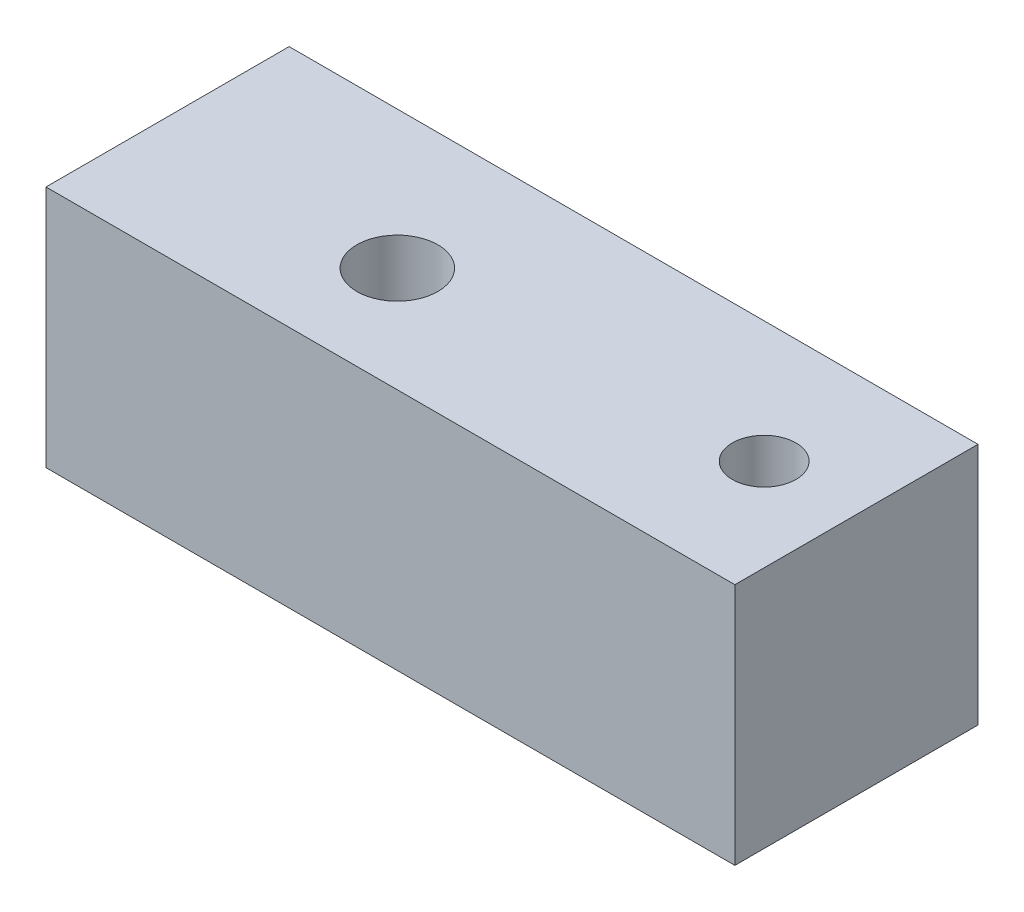
ISO-10303-21;
HEADER;
FILE_DESCRIPTION(('STEP AP214'),'2;1');
FILE_NAME('part.step','',(''),(''),'','','');
FILE_SCHEMA(('AUTOMOTIVE_DESIGN { 1 0 10303 214 1 1 1 1 }'));
ENDSEC;
DATA;
#1=APPLICATION_CONTEXT('core data for automotive mechanical design processes');
#2=APPLICATION_PROTOCOL_DEFINITION('international standard','automotive_design',2000,#1);
#3=PRODUCT_CONTEXT('',#1,'mechanical');
#4=PRODUCT('Part','Part','',(#3));
#5=PRODUCT_RELATED_PRODUCT_CATEGORY('part','',(#4));
#6=PRODUCT_DEFINITION_FORMATION('','',#4);
#7=PRODUCT_DEFINITION_CONTEXT('part definition',#1,'design');
#8=PRODUCT_DEFINITION('design','',#6,#7);
#9=PRODUCT_DEFINITION_SHAPE('','',#8);
#10=(LENGTH_UNIT() NAMED_UNIT(*) SI_UNIT(.MILLI.,.METRE.));
#11=(NAMED_UNIT(*) PLANE_ANGLE_UNIT() SI_UNIT($,.RADIAN.));
#12=(NAMED_UNIT(*) SI_UNIT($,.STERADIAN.) SOLID_ANGLE_UNIT());
#13=UNCERTAINTY_MEASURE_WITH_UNIT(LENGTH_MEASURE(1.E-05),#10,'distance_accuracy_value','');
#14=(GEOMETRIC_REPRESENTATION_CONTEXT(3) GLOBAL_UNCERTAINTY_ASSIGNED_CONTEXT((#13)) GLOBAL_UNIT_ASSIGNED_CONTEXT((#10,
#11,#12)) REPRESENTATION_CONTEXT('',''));
#15=CARTESIAN_POINT('',(0.,0.,0.));
#16=DIRECTION('',(0.,0.,1.));
#17=DIRECTION('',(1.,0.,0.));
#18=AXIS2_PLACEMENT_3D('',#15,#16,#17);
#19=CARTESIAN_POINT('',(237.834442039927,6.34999999999957,19.05));
#20=DIRECTION('',(0.,-1.,0.));
#21=DIRECTION('',(1.,0.,0.));
#22=AXIS2_PLACEMENT_3D('',#19,#20,#21);
#23=PLANE('',#22);
#24=CARTESIAN_POINT('',(230.602380141042,6.34999999999957,9.52499999998368));
#25=DIRECTION('',(0.,1.,0.));
#26=DIRECTION('',(0.,0.,1.));
#27=AXIS2_PLACEMENT_3D('',#24,#25,#26);
#28=CIRCLE('',#27,2.4892);
#29=CARTESIAN_POINT('',(230.602380141042,6.34999999999957,12.0141999999837));
#30=VERTEX_POINT('',#29);
#31=EDGE_CURVE('E143',#30,#30,#28,.T.);
#32=ORIENTED_EDGE('',*,*,#31,.F.);
#33=EDGE_LOOP('',(#32));
#34=FACE_BOUND('',#33,.T.);
#35=CARTESIAN_POINT('',(203.1333598559,6.34999999999956,10.7950000000011));
#36=DIRECTION('',(0.,1.,0.));
#37=DIRECTION('',(0.,0.,1.));
#38=AXIS2_PLACEMENT_3D('',#35,#36,#37);
#39=CIRCLE('',#38,3.17499999999998);
#40=CARTESIAN_POINT('',(203.1333598559,6.34999999999956,13.970000000001));
#41=VERTEX_POINT('',#40);
#42=EDGE_CURVE('E135',#41,#41,#39,.T.);
#43=ORIENTED_EDGE('',*,*,#42,.F.);
#44=EDGE_LOOP('',(#43));
#45=FACE_BOUND('',#44,.T.);
#46=DIRECTION('',(-1.,0.,0.));
#47=VECTOR('',#46,1.);
#48=CARTESIAN_POINT('',(237.834442039927,6.34999999999957,0.));
#49=LINE('',#48,#47);
#50=CARTESIAN_POINT('',(237.834442039927,6.34999999999957,0.));
#51=VERTEX_POINT('',#50);
#52=CARTESIAN_POINT('',(183.859442039927,6.34999999999956,0.));
#53=VERTEX_POINT('',#52);
#54=EDGE_CURVE('E111',#51,#53,#49,.T.);
#55=ORIENTED_EDGE('',*,*,#54,.T.);
#56=DIRECTION('',(0.,0.,-1.));
#57=VECTOR('',#56,1.);
#58=CARTESIAN_POINT('',(183.859442039927,6.34999999999956,19.05));
#59=LINE('',#58,#57);
#60=CARTESIAN_POINT('',(183.859442039927,6.34999999999956,19.05));
#61=VERTEX_POINT('',#60);
#62=EDGE_CURVE('E11',#61,#53,#59,.T.);
#63=ORIENTED_EDGE('',*,*,#62,.F.);
#64=DIRECTION('',(-1.,0.,0.));
#65=VECTOR('',#64,1.);
#66=CARTESIAN_POINT('',(237.834442039927,6.34999999999957,19.05));
#67=LINE('',#66,#65);
#68=CARTESIAN_POINT('',(237.834442039927,6.34999999999957,19.05));
#69=VERTEX_POINT('',#68);
#70=EDGE_CURVE('E95',#69,#61,#67,.T.);
#71=ORIENTED_EDGE('',*,*,#70,.F.);
#72=DIRECTION('',(0.,0.,-1.));
#73=VECTOR('',#72,1.);
#74=CARTESIAN_POINT('',(237.834442039927,6.34999999999957,19.05));
#75=LINE('',#74,#73);
#76=EDGE_CURVE('E107',#69,#51,#75,.T.);
#77=ORIENTED_EDGE('',*,*,#76,.T.);
#78=EDGE_LOOP('',(#55,#63,#71,#77));
#79=FACE_BOUND('',#78,.T.);
#80=ADVANCED_FACE('F43',(#34,#45,#79),#23,.F.);
#81=CARTESIAN_POINT('',(183.859442039927,6.34999999999956,19.05));
#82=DIRECTION('',(1.,0.,0.));
#83=DIRECTION('',(0.,0.,-1.));
#84=AXIS2_PLACEMENT_3D('',#81,#82,#83);
#85=PLANE('',#84);
#86=DIRECTION('',(0.,-1.,0.));
#87=VECTOR('',#86,1.);
#88=CARTESIAN_POINT('',(183.859442039927,6.34999999999956,0.));
#89=LINE('',#88,#87);
#90=CARTESIAN_POINT('',(183.859442039927,-12.7000000000005,0.));
#91=VERTEX_POINT('',#90);
#92=EDGE_CURVE('E100',#53,#91,#89,.T.);
#93=ORIENTED_EDGE('',*,*,#92,.T.);
#94=DIRECTION('',(0.,0.,-1.));
#95=VECTOR('',#94,1.);
#96=CARTESIAN_POINT('',(183.859442039927,-12.7000000000005,19.05));
#97=LINE('',#96,#95);
#98=CARTESIAN_POINT('',(183.859442039927,-12.7000000000005,19.05));
#99=VERTEX_POINT('',#98);
#100=EDGE_CURVE('E52',#99,#91,#97,.T.);
#101=ORIENTED_EDGE('',*,*,#100,.F.);
#102=DIRECTION('',(0.,-1.,0.));
#103=VECTOR('',#102,1.);
#104=CARTESIAN_POINT('',(183.859442039927,6.34999999999956,19.05));
#105=LINE('',#104,#103);
#106=EDGE_CURVE('E90',#61,#99,#105,.T.);
#107=ORIENTED_EDGE('',*,*,#106,.F.);
#108=ORIENTED_EDGE('',*,*,#62,.T.);
#109=EDGE_LOOP('',(#93,#101,#107,#108));
#110=FACE_BOUND('',#109,.T.);
#111=ADVANCED_FACE('F99',(#110),#85,.F.);
#112=CARTESIAN_POINT('',(237.834442039927,-12.7000000000004,19.05));
#113=DIRECTION('',(0.,1.,0.));
#114=DIRECTION('',(-1.,0.,0.));
#115=AXIS2_PLACEMENT_3D('',#112,#113,#114);
#116=PLANE('',#115);
#117=CARTESIAN_POINT('',(230.602380141042,-12.7000000000004,9.52499999998368));
#118=DIRECTION('',(0.,1.,0.));
#119=DIRECTION('',(0.,0.,1.));
#120=AXIS2_PLACEMENT_3D('',#117,#118,#119);
#121=CIRCLE('',#120,5.21969999999999);
#122=CARTESIAN_POINT('',(230.602380141042,-12.7000000000004,14.7446999999837));
#123=VERTEX_POINT('',#122);
#124=EDGE_CURVE('E147',#123,#123,#121,.T.);
#125=ORIENTED_EDGE('',*,*,#124,.T.);
#126=EDGE_LOOP('',(#125));
#127=FACE_BOUND('',#126,.T.);
#128=CARTESIAN_POINT('',(203.1333598559,-12.7000000000005,10.7950000000011));
#129=DIRECTION('',(0.,1.,0.));
#130=DIRECTION('',(0.,0.,1.));
#131=AXIS2_PLACEMENT_3D('',#128,#129,#130);
#132=CIRCLE('',#131,3.17499999999998);
#133=CARTESIAN_POINT('',(203.1333598559,-12.7000000000005,13.970000000001));
#134=VERTEX_POINT('',#133);
#135=EDGE_CURVE('E115',#134,#134,#132,.T.);
#136=ORIENTED_EDGE('',*,*,#135,.T.);
#137=EDGE_LOOP('',(#136));
#138=FACE_BOUND('',#137,.T.);
#139=DIRECTION('',(1.,0.,0.));
#140=VECTOR('',#139,1.);
#141=CARTESIAN_POINT('',(237.834442039927,-12.7000000000004,0.));
#142=LINE('',#141,#140);
#143=CARTESIAN_POINT('',(237.834442039927,-12.7000000000004,0.));
#144=VERTEX_POINT('',#143);
#145=EDGE_CURVE('E77',#91,#144,#142,.T.);
#146=ORIENTED_EDGE('',*,*,#145,.T.);
#147=DIRECTION('',(0.,0.,-1.));
#148=VECTOR('',#147,1.);
#149=CARTESIAN_POINT('',(237.834442039927,-12.7000000000004,19.05));
#150=LINE('',#149,#148);
#151=CARTESIAN_POINT('',(237.834442039927,-12.7000000000004,19.05));
#152=VERTEX_POINT('',#151);
#153=EDGE_CURVE('E102',#152,#144,#150,.T.);
#154=ORIENTED_EDGE('',*,*,#153,.F.);
#155=DIRECTION('',(1.,0.,0.));
#156=VECTOR('',#155,1.);
#157=CARTESIAN_POINT('',(237.834442039927,-12.7000000000004,19.05));
#158=LINE('',#157,#156);
#159=EDGE_CURVE('E93',#99,#152,#158,.T.);
#160=ORIENTED_EDGE('',*,*,#159,.F.);
#161=ORIENTED_EDGE('',*,*,#100,.T.);
#162=EDGE_LOOP('',(#146,#154,#160,#161));
#163=FACE_BOUND('',#162,.T.);
#164=ADVANCED_FACE('F103',(#127,#138,#163),#116,.F.);
#165=CARTESIAN_POINT('',(237.834442039927,-12.7000000000004,19.05));
#166=DIRECTION('',(-1.,0.,0.));
#167=DIRECTION('',(0.,0.,1.));
#168=AXIS2_PLACEMENT_3D('',#165,#166,#167);
#169=PLANE('',#168);
#170=DIRECTION('',(0.,1.,0.));
#171=VECTOR('',#170,1.);
#172=CARTESIAN_POINT('',(237.834442039927,-12.7000000000004,0.));
#173=LINE('',#172,#171);
#174=EDGE_CURVE('E83',#144,#51,#173,.T.);
#175=ORIENTED_EDGE('',*,*,#174,.T.);
#176=ORIENTED_EDGE('',*,*,#76,.F.);
#177=DIRECTION('',(0.,1.,0.));
#178=VECTOR('',#177,1.);
#179=CARTESIAN_POINT('',(237.834442039927,-12.7000000000004,19.05));
#180=LINE('',#179,#178);
#181=EDGE_CURVE('E60',#152,#69,#180,.T.);
#182=ORIENTED_EDGE('',*,*,#181,.F.);
#183=ORIENTED_EDGE('',*,*,#153,.T.);
#184=EDGE_LOOP('',(#175,#176,#182,#183));
#185=FACE_BOUND('',#184,.T.);
#186=ADVANCED_FACE('F125',(#185),#169,.F.);
#187=CARTESIAN_POINT('',(0.,0.,19.05));
#188=DIRECTION('',(0.,0.,1.));
#189=DIRECTION('',(1.,0.,0.));
#190=AXIS2_PLACEMENT_3D('',#187,#188,#189);
#191=PLANE('',#190);
#192=ORIENTED_EDGE('',*,*,#70,.T.);
#193=ORIENTED_EDGE('',*,*,#106,.T.);
#194=ORIENTED_EDGE('',*,*,#159,.T.);
#195=ORIENTED_EDGE('',*,*,#181,.T.);
#196=EDGE_LOOP('',(#192,#193,#194,#195));
#197=FACE_BOUND('',#196,.T.);
#198=ADVANCED_FACE('F91',(#197),#191,.T.);
#199=CARTESIAN_POINT('',(0.,0.,0.));
#200=DIRECTION('',(0.,0.,1.));
#201=DIRECTION('',(1.,0.,0.));
#202=AXIS2_PLACEMENT_3D('',#199,#200,#201);
#203=PLANE('',#202);
#204=ORIENTED_EDGE('',*,*,#54,.F.);
#205=ORIENTED_EDGE('',*,*,#174,.F.);
#206=ORIENTED_EDGE('',*,*,#145,.F.);
#207=ORIENTED_EDGE('',*,*,#92,.F.);
#208=EDGE_LOOP('',(#204,#205,#206,#207));
#209=FACE_BOUND('',#208,.T.);
#210=ADVANCED_FACE('F128',(#209),#203,.F.);
#211=CARTESIAN_POINT('',(203.1333598559,6.34999999999956,10.7950000000011));
#212=DIRECTION('',(0.,1.,0.));
#213=DIRECTION('',(0.,0.,1.));
#214=AXIS2_PLACEMENT_3D('',#211,#212,#213);
#215=CYLINDRICAL_SURFACE('',#214,3.17499999999998);
#216=ORIENTED_EDGE('',*,*,#135,.F.);
#217=EDGE_LOOP('',(#216));
#218=FACE_BOUND('',#217,.T.);
#219=ORIENTED_EDGE('',*,*,#42,.T.);
#220=EDGE_LOOP('',(#219));
#221=FACE_BOUND('',#220,.T.);
#222=ADVANCED_FACE('F158',(#218,#221),#215,.F.);
#223=CARTESIAN_POINT('',(230.602380141042,-9.55891906408349,9.52499999998368));
#224=DIRECTION('',(0.,-1.,0.));
#225=DIRECTION('',(0.,0.,-1.));
#226=AXIS2_PLACEMENT_3D('',#223,#224,#225);
#227=CONICAL_SURFACE('',#226,2.4892,0.715584993317676);
#228=ORIENTED_EDGE('',*,*,#124,.F.);
#229=EDGE_LOOP('',(#228));
#230=FACE_BOUND('',#229,.T.);
#231=CARTESIAN_POINT('',(230.602380141042,-9.55891906408349,9.52499999998368));
#232=DIRECTION('',(0.,1.,0.));
#233=DIRECTION('',(0.,0.,1.));
#234=AXIS2_PLACEMENT_3D('',#231,#232,#233);
#235=CIRCLE('',#234,2.4892);
#236=CARTESIAN_POINT('',(230.602380141042,-9.55891906408349,12.0141999999837));
#237=VERTEX_POINT('',#236);
#238=EDGE_CURVE('E139',#237,#237,#235,.T.);
#239=ORIENTED_EDGE('',*,*,#238,.T.);
#240=EDGE_LOOP('',(#239));
#241=FACE_BOUND('',#240,.T.);
#242=ADVANCED_FACE('F154',(#230,#241),#227,.F.);
#243=CARTESIAN_POINT('',(230.602380141042,6.34999999999956,9.52499999998368));
#244=DIRECTION('',(0.,1.,0.));
#245=DIRECTION('',(0.,0.,1.));
#246=AXIS2_PLACEMENT_3D('',#243,#244,#245);
#247=CYLINDRICAL_SURFACE('',#246,2.4892);
#248=ORIENTED_EDGE('',*,*,#238,.F.);
#249=EDGE_LOOP('',(#248));
#250=FACE_BOUND('',#249,.T.);
#251=ORIENTED_EDGE('',*,*,#31,.T.);
#252=EDGE_LOOP('',(#251));
#253=FACE_BOUND('',#252,.T.);
#254=ADVANCED_FACE('F157',(#250,#253),#247,.F.);
#255=CLOSED_SHELL('',(#80,#111,#164,#186,#198,#210,#222,#242,#254));
#256=MANIFOLD_SOLID_BREP('B2',#255);
#257=ADVANCED_BREP_SHAPE_REPRESENTATION('',(#18,#256),#14);
#258=SHAPE_DEFINITION_REPRESENTATION(#9,#257);
ENDSEC;
END-ISO-10303-21;
